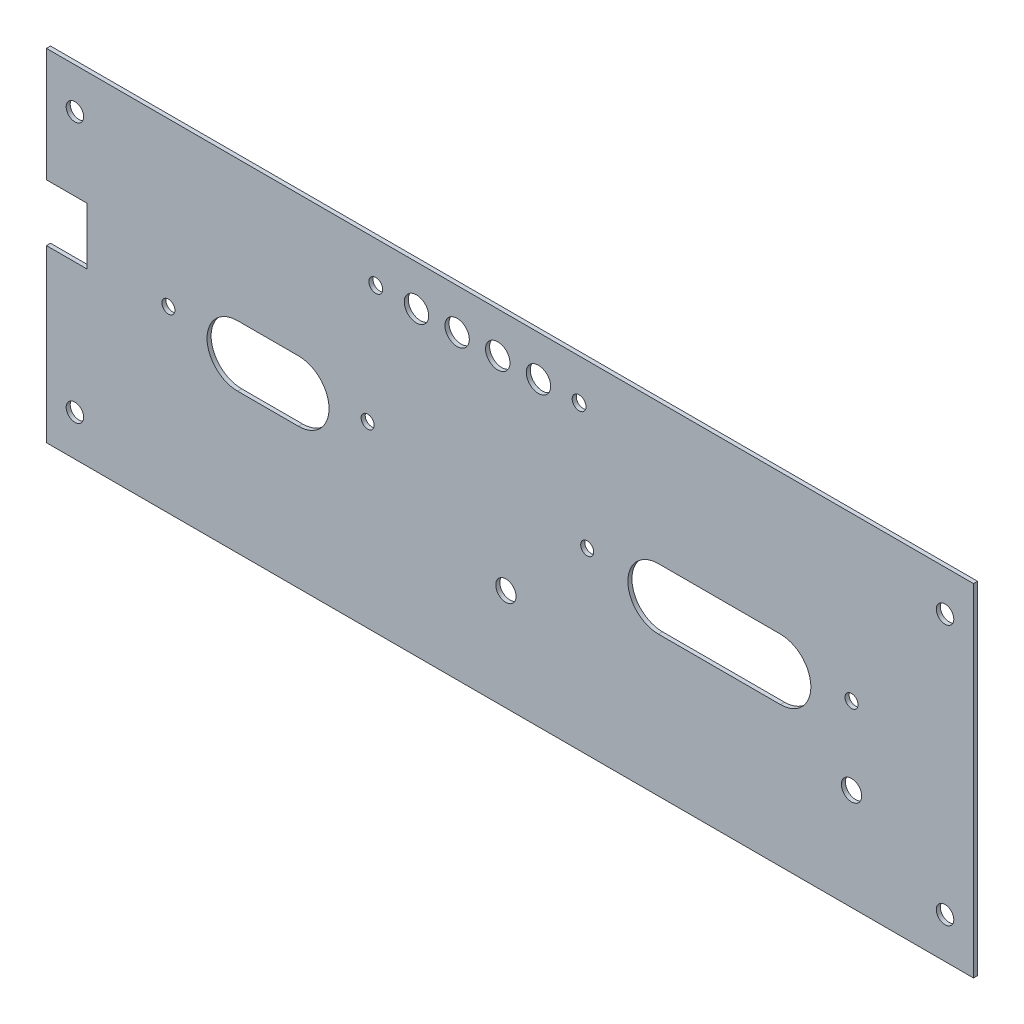
ISO-10303-21;
HEADER;
FILE_DESCRIPTION(('STEP AP214'),'2;1');
FILE_NAME('part.step','',(''),(''),'','','');
FILE_SCHEMA(('AUTOMOTIVE_DESIGN { 1 0 10303 214 1 1 1 1 }'));
ENDSEC;
DATA;
#1=APPLICATION_CONTEXT('core data for automotive mechanical design processes');
#2=APPLICATION_PROTOCOL_DEFINITION('international standard','automotive_design',2000,#1);
#3=PRODUCT_CONTEXT('',#1,'mechanical');
#4=PRODUCT('Part','Part','',(#3));
#5=PRODUCT_RELATED_PRODUCT_CATEGORY('part','',(#4));
#6=PRODUCT_DEFINITION_FORMATION('','',#4);
#7=PRODUCT_DEFINITION_CONTEXT('part definition',#1,'design');
#8=PRODUCT_DEFINITION('design','',#6,#7);
#9=PRODUCT_DEFINITION_SHAPE('','',#8);
#10=(LENGTH_UNIT() NAMED_UNIT(*) SI_UNIT(.MILLI.,.METRE.));
#11=(NAMED_UNIT(*) PLANE_ANGLE_UNIT() SI_UNIT($,.RADIAN.));
#12=(NAMED_UNIT(*) SI_UNIT($,.STERADIAN.) SOLID_ANGLE_UNIT());
#13=UNCERTAINTY_MEASURE_WITH_UNIT(LENGTH_MEASURE(1.E-05),#10,'distance_accuracy_value','');
#14=(GEOMETRIC_REPRESENTATION_CONTEXT(3) GLOBAL_UNCERTAINTY_ASSIGNED_CONTEXT((#13)) GLOBAL_UNIT_ASSIGNED_CONTEXT((#10,
#11,#12)) REPRESENTATION_CONTEXT('',''));
#15=CARTESIAN_POINT('',(0.,0.,0.));
#16=DIRECTION('',(0.,0.,1.));
#17=DIRECTION('',(1.,0.,0.));
#18=AXIS2_PLACEMENT_3D('',#15,#16,#17);
#19=CARTESIAN_POINT('',(-114.,-42.,1.));
#20=DIRECTION('',(1.,0.,0.));
#21=DIRECTION('',(0.,0.,-1.));
#22=AXIS2_PLACEMENT_3D('',#19,#20,#21);
#23=PLANE('',#22);
#24=DIRECTION('',(0.,-1.,0.));
#25=VECTOR('',#24,1.);
#26=CARTESIAN_POINT('',(-114.,-42.,0.));
#27=LINE('',#26,#25);
#28=CARTESIAN_POINT('',(-114.,42.,0.));
#29=VERTEX_POINT('',#28);
#30=CARTESIAN_POINT('',(-114.,14.,0.));
#31=VERTEX_POINT('',#30);
#32=EDGE_CURVE('E293',#29,#31,#27,.T.);
#33=ORIENTED_EDGE('',*,*,#32,.T.);
#34=DIRECTION('',(0.,0.,1.));
#35=VECTOR('',#34,1.);
#36=CARTESIAN_POINT('',(-114.,14.,1.));
#37=LINE('',#36,#35);
#38=CARTESIAN_POINT('',(-114.,14.,1.));
#39=VERTEX_POINT('',#38);
#40=EDGE_CURVE('E11',#31,#39,#37,.T.);
#41=ORIENTED_EDGE('',*,*,#40,.T.);
#42=DIRECTION('',(0.,-1.,0.));
#43=VECTOR('',#42,1.);
#44=CARTESIAN_POINT('',(-114.,-42.,1.));
#45=LINE('',#44,#43);
#46=CARTESIAN_POINT('',(-114.,42.,1.));
#47=VERTEX_POINT('',#46);
#48=EDGE_CURVE('E282',#47,#39,#45,.T.);
#49=ORIENTED_EDGE('',*,*,#48,.F.);
#50=DIRECTION('',(0.,0.,-1.));
#51=VECTOR('',#50,1.);
#52=CARTESIAN_POINT('',(-114.,42.,1.));
#53=LINE('',#52,#51);
#54=EDGE_CURVE('E292',#47,#29,#53,.T.);
#55=ORIENTED_EDGE('',*,*,#54,.T.);
#56=EDGE_LOOP('',(#33,#41,#49,#55));
#57=FACE_BOUND('',#56,.T.);
#58=ADVANCED_FACE('F31',(#57),#23,.F.);
#59=CARTESIAN_POINT('',(-114.,-42.,1.));
#60=DIRECTION('',(0.,0.,-1.));
#61=DIRECTION('',(-1.,0.,0.));
#62=AXIS2_PLACEMENT_3D('',#59,#60,#61);
#63=PLANE('',#62);
#64=CARTESIAN_POINT('',(84.,-17.,1.));
#65=DIRECTION('',(0.,0.,1.));
#66=DIRECTION('',(1.,0.,0.));
#67=AXIS2_PLACEMENT_3D('',#64,#65,#66);
#68=CIRCLE('',#67,2.5);
#69=CARTESIAN_POINT('',(86.5,-17.,1.));
#70=VERTEX_POINT('',#69);
#71=EDGE_CURVE('E350',#70,#70,#68,.T.);
#72=ORIENTED_EDGE('',*,*,#71,.F.);
#73=EDGE_LOOP('',(#72));
#74=FACE_BOUND('',#73,.T.);
#75=CARTESIAN_POINT('',(-23.,32.,1.));
#76=DIRECTION('',(0.,0.,1.));
#77=DIRECTION('',(1.,0.,0.));
#78=AXIS2_PLACEMENT_3D('',#75,#76,#77);
#79=CIRCLE('',#78,3.);
#80=CARTESIAN_POINT('',(-20.,32.,1.));
#81=VERTEX_POINT('',#80);
#82=EDGE_CURVE('E340',#81,#81,#79,.T.);
#83=ORIENTED_EDGE('',*,*,#82,.F.);
#84=EDGE_LOOP('',(#83));
#85=FACE_BOUND('',#84,.T.);
#86=CARTESIAN_POINT('',(-13.,32.,1.));
#87=DIRECTION('',(0.,0.,1.));
#88=DIRECTION('',(1.,0.,0.));
#89=AXIS2_PLACEMENT_3D('',#86,#87,#88);
#90=CIRCLE('',#89,3.);
#91=CARTESIAN_POINT('',(-10.,32.,1.));
#92=VERTEX_POINT('',#91);
#93=EDGE_CURVE('E337',#92,#92,#90,.T.);
#94=ORIENTED_EDGE('',*,*,#93,.F.);
#95=EDGE_LOOP('',(#94));
#96=FACE_BOUND('',#95,.T.);
#97=CARTESIAN_POINT('',(-3.00000000000001,32.,1.));
#98=DIRECTION('',(0.,0.,1.));
#99=DIRECTION('',(1.,0.,0.));
#100=AXIS2_PLACEMENT_3D('',#97,#98,#99);
#101=CIRCLE('',#100,3.);
#102=CARTESIAN_POINT('',(0.,32.,1.));
#103=VERTEX_POINT('',#102);
#104=EDGE_CURVE('E334',#103,#103,#101,.T.);
#105=ORIENTED_EDGE('',*,*,#104,.F.);
#106=EDGE_LOOP('',(#105));
#107=FACE_BOUND('',#106,.T.);
#108=CARTESIAN_POINT('',(6.99999999999999,32.,1.));
#109=DIRECTION('',(0.,0.,1.));
#110=DIRECTION('',(1.,0.,0.));
#111=AXIS2_PLACEMENT_3D('',#108,#109,#110);
#112=CIRCLE('',#111,3.);
#113=CARTESIAN_POINT('',(9.99999999999999,32.,1.));
#114=VERTEX_POINT('',#113);
#115=EDGE_CURVE('E330',#114,#114,#112,.T.);
#116=ORIENTED_EDGE('',*,*,#115,.F.);
#117=EDGE_LOOP('',(#116));
#118=FACE_BOUND('',#117,.T.);
#119=CARTESIAN_POINT('',(-1.00000000000001,-17.,1.));
#120=DIRECTION('',(0.,0.,1.));
#121=DIRECTION('',(1.,0.,0.));
#122=AXIS2_PLACEMENT_3D('',#119,#120,#121);
#123=CIRCLE('',#122,2.5);
#124=CARTESIAN_POINT('',(1.49999999999999,-17.,1.));
#125=VERTEX_POINT('',#124);
#126=EDGE_CURVE('E326',#125,#125,#123,.T.);
#127=ORIENTED_EDGE('',*,*,#126,.F.);
#128=EDGE_LOOP('',(#127));
#129=FACE_BOUND('',#128,.T.);
#130=CARTESIAN_POINT('',(17.,32.,1.));
#131=DIRECTION('',(0.,0.,1.));
#132=DIRECTION('',(1.,0.,0.));
#133=AXIS2_PLACEMENT_3D('',#130,#131,#132);
#134=CIRCLE('',#133,1.7);
#135=CARTESIAN_POINT('',(18.7,32.,1.));
#136=VERTEX_POINT('',#135);
#137=EDGE_CURVE('E322',#136,#136,#134,.T.);
#138=ORIENTED_EDGE('',*,*,#137,.F.);
#139=EDGE_LOOP('',(#138));
#140=FACE_BOUND('',#139,.T.);
#141=CARTESIAN_POINT('',(-33.,32.,1.));
#142=DIRECTION('',(0.,0.,1.));
#143=DIRECTION('',(1.,0.,0.));
#144=AXIS2_PLACEMENT_3D('',#141,#142,#143);
#145=CIRCLE('',#144,1.7);
#146=CARTESIAN_POINT('',(-31.3,32.,1.));
#147=VERTEX_POINT('',#146);
#148=EDGE_CURVE('E318',#147,#147,#145,.T.);
#149=ORIENTED_EDGE('',*,*,#148,.F.);
#150=EDGE_LOOP('',(#149));
#151=FACE_BOUND('',#150,.T.);
#152=CARTESIAN_POINT('',(-35.,2.00000000000001,1.));
#153=DIRECTION('',(0.,0.,1.));
#154=DIRECTION('',(1.,0.,0.));
#155=AXIS2_PLACEMENT_3D('',#152,#153,#154);
#156=CIRCLE('',#155,1.60000000000001);
#157=CARTESIAN_POINT('',(-33.4,2.00000000000001,1.));
#158=VERTEX_POINT('',#157);
#159=EDGE_CURVE('E170',#158,#158,#156,.T.);
#160=ORIENTED_EDGE('',*,*,#159,.F.);
#161=EDGE_LOOP('',(#160));
#162=FACE_BOUND('',#161,.T.);
#163=DIRECTION('',(1.,0.,0.));
#164=VECTOR('',#163,1.);
#165=CARTESIAN_POINT('',(-67.,-7.5,1.));
#166=LINE('',#165,#164);
#167=CARTESIAN_POINT('',(-67.,-7.5,1.));
#168=VERTEX_POINT('',#167);
#169=CARTESIAN_POINT('',(-52.,-7.5,1.));
#170=VERTEX_POINT('',#169);
#171=EDGE_CURVE('E176',#168,#170,#166,.T.);
#172=ORIENTED_EDGE('',*,*,#171,.F.);
#173=CARTESIAN_POINT('',(-67.,0.,1.));
#174=DIRECTION('',(0.,0.,1.));
#175=DIRECTION('',(1.,0.,0.));
#176=AXIS2_PLACEMENT_3D('',#173,#174,#175);
#177=CIRCLE('',#176,7.5);
#178=CARTESIAN_POINT('',(-67.,7.5,1.));
#179=VERTEX_POINT('',#178);
#180=EDGE_CURVE('E48',#179,#168,#177,.T.);
#181=ORIENTED_EDGE('',*,*,#180,.F.);
#182=DIRECTION('',(-1.,0.,0.));
#183=VECTOR('',#182,1.);
#184=CARTESIAN_POINT('',(-67.,7.5,1.));
#185=LINE('',#184,#183);
#186=CARTESIAN_POINT('',(-52.,7.5,1.));
#187=VERTEX_POINT('',#186);
#188=EDGE_CURVE('E164',#187,#179,#185,.T.);
#189=ORIENTED_EDGE('',*,*,#188,.F.);
#190=CARTESIAN_POINT('',(-52.,0.,1.));
#191=DIRECTION('',(0.,0.,1.));
#192=DIRECTION('',(-1.,0.,0.));
#193=AXIS2_PLACEMENT_3D('',#190,#191,#192);
#194=CIRCLE('',#193,7.5);
#195=EDGE_CURVE('E167',#170,#187,#194,.T.);
#196=ORIENTED_EDGE('',*,*,#195,.F.);
#197=EDGE_LOOP('',(#172,#181,#189,#196));
#198=FACE_BOUND('',#197,.T.);
#199=CARTESIAN_POINT('',(-84.,2.00000000000001,1.));
#200=DIRECTION('',(0.,0.,1.));
#201=DIRECTION('',(1.,0.,0.));
#202=AXIS2_PLACEMENT_3D('',#199,#200,#201);
#203=CIRCLE('',#202,1.60000000000001);
#204=CARTESIAN_POINT('',(-82.4,2.00000000000001,1.));
#205=VERTEX_POINT('',#204);
#206=EDGE_CURVE('E183',#205,#205,#203,.T.);
#207=ORIENTED_EDGE('',*,*,#206,.F.);
#208=EDGE_LOOP('',(#207));
#209=FACE_BOUND('',#208,.T.);
#210=CARTESIAN_POINT('',(84.,2.00000000000001,1.));
#211=DIRECTION('',(0.,0.,1.));
#212=DIRECTION('',(1.,0.,0.));
#213=AXIS2_PLACEMENT_3D('',#210,#211,#212);
#214=CIRCLE('',#213,1.60000000000001);
#215=CARTESIAN_POINT('',(85.6,2.00000000000001,1.));
#216=VERTEX_POINT('',#215);
#217=EDGE_CURVE('E190',#216,#216,#214,.T.);
#218=ORIENTED_EDGE('',*,*,#217,.F.);
#219=EDGE_LOOP('',(#218));
#220=FACE_BOUND('',#219,.T.);
#221=DIRECTION('',(1.,0.,0.));
#222=VECTOR('',#221,1.);
#223=CARTESIAN_POINT('',(36.5,-7.5,1.));
#224=LINE('',#223,#222);
#225=CARTESIAN_POINT('',(36.5,-7.5,1.));
#226=VERTEX_POINT('',#225);
#227=CARTESIAN_POINT('',(66.5,-7.5,1.));
#228=VERTEX_POINT('',#227);
#229=EDGE_CURVE('E214',#226,#228,#224,.T.);
#230=ORIENTED_EDGE('',*,*,#229,.F.);
#231=CARTESIAN_POINT('',(36.5,0.,1.));
#232=DIRECTION('',(0.,0.,1.));
#233=DIRECTION('',(1.,0.,0.));
#234=AXIS2_PLACEMENT_3D('',#231,#232,#233);
#235=CIRCLE('',#234,7.5);
#236=CARTESIAN_POINT('',(36.5,7.5,1.));
#237=VERTEX_POINT('',#236);
#238=EDGE_CURVE('E196',#237,#226,#235,.T.);
#239=ORIENTED_EDGE('',*,*,#238,.F.);
#240=DIRECTION('',(-1.,0.,0.));
#241=VECTOR('',#240,1.);
#242=CARTESIAN_POINT('',(36.5,7.5,1.));
#243=LINE('',#242,#241);
#244=CARTESIAN_POINT('',(66.5,7.5,1.));
#245=VERTEX_POINT('',#244);
#246=EDGE_CURVE('E203',#245,#237,#243,.T.);
#247=ORIENTED_EDGE('',*,*,#246,.F.);
#248=CARTESIAN_POINT('',(66.5,0.,1.));
#249=DIRECTION('',(0.,0.,1.));
#250=DIRECTION('',(-1.,0.,0.));
#251=AXIS2_PLACEMENT_3D('',#248,#249,#250);
#252=CIRCLE('',#251,7.5);
#253=EDGE_CURVE('E217',#228,#245,#252,.T.);
#254=ORIENTED_EDGE('',*,*,#253,.F.);
#255=EDGE_LOOP('',(#230,#239,#247,#254));
#256=FACE_BOUND('',#255,.T.);
#257=CARTESIAN_POINT('',(19.,2.00000000000001,1.));
#258=DIRECTION('',(0.,0.,1.));
#259=DIRECTION('',(1.,0.,0.));
#260=AXIS2_PLACEMENT_3D('',#257,#258,#259);
#261=CIRCLE('',#260,1.60000000000001);
#262=CARTESIAN_POINT('',(20.6,2.00000000000001,1.));
#263=VERTEX_POINT('',#262);
#264=EDGE_CURVE('E224',#263,#263,#261,.T.);
#265=ORIENTED_EDGE('',*,*,#264,.F.);
#266=EDGE_LOOP('',(#265));
#267=FACE_BOUND('',#266,.T.);
#268=CARTESIAN_POINT('',(-107.,-32.,1.));
#269=DIRECTION('',(0.,0.,1.));
#270=DIRECTION('',(1.,0.,0.));
#271=AXIS2_PLACEMENT_3D('',#268,#269,#270);
#272=CIRCLE('',#271,2.15);
#273=CARTESIAN_POINT('',(-104.85,-32.,1.));
#274=VERTEX_POINT('',#273);
#275=EDGE_CURVE('E264',#274,#274,#272,.T.);
#276=ORIENTED_EDGE('',*,*,#275,.F.);
#277=EDGE_LOOP('',(#276));
#278=FACE_BOUND('',#277,.T.);
#279=CARTESIAN_POINT('',(107.,32.,1.));
#280=DIRECTION('',(0.,0.,1.));
#281=DIRECTION('',(1.,0.,0.));
#282=AXIS2_PLACEMENT_3D('',#279,#280,#281);
#283=CIRCLE('',#282,2.15);
#284=CARTESIAN_POINT('',(109.15,32.,1.));
#285=VERTEX_POINT('',#284);
#286=EDGE_CURVE('E276',#285,#285,#283,.T.);
#287=ORIENTED_EDGE('',*,*,#286,.F.);
#288=EDGE_LOOP('',(#287));
#289=FACE_BOUND('',#288,.T.);
#290=ORIENTED_EDGE('',*,*,#48,.T.);
#291=DIRECTION('',(-1.,0.,0.));
#292=VECTOR('',#291,1.);
#293=CARTESIAN_POINT('',(-118.464145401672,14.,1.));
#294=LINE('',#293,#292);
#295=CARTESIAN_POINT('',(-104.,14.,1.));
#296=VERTEX_POINT('',#295);
#297=EDGE_CURVE('E241',#296,#39,#294,.T.);
#298=ORIENTED_EDGE('',*,*,#297,.F.);
#299=DIRECTION('',(0.,1.,0.));
#300=VECTOR('',#299,1.);
#301=CARTESIAN_POINT('',(-104.,0.,1.));
#302=LINE('',#301,#300);
#303=CARTESIAN_POINT('',(-104.,0.,1.));
#304=VERTEX_POINT('',#303);
#305=EDGE_CURVE('E249',#304,#296,#302,.T.);
#306=ORIENTED_EDGE('',*,*,#305,.F.);
#307=DIRECTION('',(1.,0.,0.));
#308=VECTOR('',#307,1.);
#309=CARTESIAN_POINT('',(-118.464145401672,0.,1.));
#310=LINE('',#309,#308);
#311=CARTESIAN_POINT('',(-114.,0.,1.));
#312=VERTEX_POINT('',#311);
#313=EDGE_CURVE('E234',#312,#304,#310,.T.);
#314=ORIENTED_EDGE('',*,*,#313,.F.);
#315=CARTESIAN_POINT('',(-114.,-42.,1.));
#316=VERTEX_POINT('',#315);
#317=EDGE_CURVE('E286',#312,#316,#45,.T.);
#318=ORIENTED_EDGE('',*,*,#317,.T.);
#319=DIRECTION('',(1.,0.,0.));
#320=VECTOR('',#319,1.);
#321=CARTESIAN_POINT('',(-114.,-42.,1.));
#322=LINE('',#321,#320);
#323=CARTESIAN_POINT('',(114.,-42.,1.));
#324=VERTEX_POINT('',#323);
#325=EDGE_CURVE('E285',#316,#324,#322,.T.);
#326=ORIENTED_EDGE('',*,*,#325,.T.);
#327=DIRECTION('',(0.,1.,0.));
#328=VECTOR('',#327,1.);
#329=CARTESIAN_POINT('',(114.,-42.,1.));
#330=LINE('',#329,#328);
#331=CARTESIAN_POINT('',(114.,42.,1.));
#332=VERTEX_POINT('',#331);
#333=EDGE_CURVE('E288',#324,#332,#330,.T.);
#334=ORIENTED_EDGE('',*,*,#333,.T.);
#335=DIRECTION('',(-1.,0.,0.));
#336=VECTOR('',#335,1.);
#337=CARTESIAN_POINT('',(-114.,42.,1.));
#338=LINE('',#337,#336);
#339=EDGE_CURVE('E290',#332,#47,#338,.T.);
#340=ORIENTED_EDGE('',*,*,#339,.T.);
#341=EDGE_LOOP('',(#290,#298,#306,#314,#318,#326,#334,#340));
#342=FACE_BOUND('',#341,.T.);
#343=CARTESIAN_POINT('',(-107.,32.,1.));
#344=DIRECTION('',(0.,0.,1.));
#345=DIRECTION('',(-1.,0.,0.));
#346=AXIS2_PLACEMENT_3D('',#343,#344,#345);
#347=CIRCLE('',#346,2.15);
#348=CARTESIAN_POINT('',(-109.15,32.,1.));
#349=VERTEX_POINT('',#348);
#350=EDGE_CURVE('E270',#349,#349,#347,.T.);
#351=ORIENTED_EDGE('',*,*,#350,.F.);
#352=EDGE_LOOP('',(#351));
#353=FACE_BOUND('',#352,.T.);
#354=CARTESIAN_POINT('',(107.,-32.,1.));
#355=DIRECTION('',(0.,0.,1.));
#356=DIRECTION('',(-1.,0.,0.));
#357=AXIS2_PLACEMENT_3D('',#354,#355,#356);
#358=CIRCLE('',#357,2.15);
#359=CARTESIAN_POINT('',(104.85,-32.,1.));
#360=VERTEX_POINT('',#359);
#361=EDGE_CURVE('E258',#360,#360,#358,.T.);
#362=ORIENTED_EDGE('',*,*,#361,.F.);
#363=EDGE_LOOP('',(#362));
#364=FACE_BOUND('',#363,.T.);
#365=ADVANCED_FACE('F370',(#74,#85,#96,#107,#118,#129,#140,#151,#162,#198,#209,#220,#256,#267,
#278,#289,#342,#353,#364),#63,.F.);
#366=CARTESIAN_POINT('',(-114.,-42.,0.));
#367=DIRECTION('',(0.,0.,-1.));
#368=DIRECTION('',(-1.,0.,0.));
#369=AXIS2_PLACEMENT_3D('',#366,#367,#368);
#370=PLANE('',#369);
#371=CARTESIAN_POINT('',(84.,-17.,0.));
#372=DIRECTION('',(0.,0.,-1.));
#373=DIRECTION('',(-1.,0.,0.));
#374=AXIS2_PLACEMENT_3D('',#371,#372,#373);
#375=CIRCLE('',#374,2.5);
#376=CARTESIAN_POINT('',(81.5,-17.,0.));
#377=VERTEX_POINT('',#376);
#378=EDGE_CURVE('E35',#377,#377,#375,.T.);
#379=ORIENTED_EDGE('',*,*,#378,.F.);
#380=EDGE_LOOP('',(#379));
#381=FACE_BOUND('',#380,.T.);
#382=CARTESIAN_POINT('',(-23.,32.,0.));
#383=DIRECTION('',(0.,0.,-1.));
#384=DIRECTION('',(-1.,0.,0.));
#385=AXIS2_PLACEMENT_3D('',#382,#383,#384);
#386=CIRCLE('',#385,3.);
#387=CARTESIAN_POINT('',(-26.,32.,0.));
#388=VERTEX_POINT('',#387);
#389=EDGE_CURVE('E338',#388,#388,#386,.T.);
#390=ORIENTED_EDGE('',*,*,#389,.F.);
#391=EDGE_LOOP('',(#390));
#392=FACE_BOUND('',#391,.T.);
#393=CARTESIAN_POINT('',(-13.,32.,0.));
#394=DIRECTION('',(0.,0.,-1.));
#395=DIRECTION('',(-1.,0.,0.));
#396=AXIS2_PLACEMENT_3D('',#393,#394,#395);
#397=CIRCLE('',#396,3.);
#398=CARTESIAN_POINT('',(-16.,32.,0.));
#399=VERTEX_POINT('',#398);
#400=EDGE_CURVE('E335',#399,#399,#397,.T.);
#401=ORIENTED_EDGE('',*,*,#400,.F.);
#402=EDGE_LOOP('',(#401));
#403=FACE_BOUND('',#402,.T.);
#404=CARTESIAN_POINT('',(-3.00000000000001,32.,0.));
#405=DIRECTION('',(0.,0.,-1.));
#406=DIRECTION('',(-1.,0.,0.));
#407=AXIS2_PLACEMENT_3D('',#404,#405,#406);
#408=CIRCLE('',#407,3.);
#409=CARTESIAN_POINT('',(-6.00000000000001,32.,0.));
#410=VERTEX_POINT('',#409);
#411=EDGE_CURVE('E331',#410,#410,#408,.T.);
#412=ORIENTED_EDGE('',*,*,#411,.F.);
#413=EDGE_LOOP('',(#412));
#414=FACE_BOUND('',#413,.T.);
#415=CARTESIAN_POINT('',(6.99999999999999,32.,0.));
#416=DIRECTION('',(0.,0.,-1.));
#417=DIRECTION('',(-1.,0.,0.));
#418=AXIS2_PLACEMENT_3D('',#415,#416,#417);
#419=CIRCLE('',#418,3.);
#420=CARTESIAN_POINT('',(3.99999999999998,32.,0.));
#421=VERTEX_POINT('',#420);
#422=EDGE_CURVE('E327',#421,#421,#419,.T.);
#423=ORIENTED_EDGE('',*,*,#422,.F.);
#424=EDGE_LOOP('',(#423));
#425=FACE_BOUND('',#424,.T.);
#426=CARTESIAN_POINT('',(-1.00000000000001,-17.,0.));
#427=DIRECTION('',(0.,0.,-1.));
#428=DIRECTION('',(-1.,0.,0.));
#429=AXIS2_PLACEMENT_3D('',#426,#427,#428);
#430=CIRCLE('',#429,2.5);
#431=CARTESIAN_POINT('',(-3.50000000000001,-17.,0.));
#432=VERTEX_POINT('',#431);
#433=EDGE_CURVE('E323',#432,#432,#430,.T.);
#434=ORIENTED_EDGE('',*,*,#433,.F.);
#435=EDGE_LOOP('',(#434));
#436=FACE_BOUND('',#435,.T.);
#437=CARTESIAN_POINT('',(17.,32.,0.));
#438=DIRECTION('',(0.,0.,-1.));
#439=DIRECTION('',(-1.,0.,0.));
#440=AXIS2_PLACEMENT_3D('',#437,#438,#439);
#441=CIRCLE('',#440,1.7);
#442=CARTESIAN_POINT('',(15.3,32.,0.));
#443=VERTEX_POINT('',#442);
#444=EDGE_CURVE('E319',#443,#443,#441,.T.);
#445=ORIENTED_EDGE('',*,*,#444,.F.);
#446=EDGE_LOOP('',(#445));
#447=FACE_BOUND('',#446,.T.);
#448=CARTESIAN_POINT('',(-33.,32.,0.));
#449=DIRECTION('',(0.,0.,-1.));
#450=DIRECTION('',(-1.,0.,0.));
#451=AXIS2_PLACEMENT_3D('',#448,#449,#450);
#452=CIRCLE('',#451,1.7);
#453=CARTESIAN_POINT('',(-34.7,32.,0.));
#454=VERTEX_POINT('',#453);
#455=EDGE_CURVE('E315',#454,#454,#452,.T.);
#456=ORIENTED_EDGE('',*,*,#455,.F.);
#457=EDGE_LOOP('',(#456));
#458=FACE_BOUND('',#457,.T.);
#459=CARTESIAN_POINT('',(-35.,2.00000000000001,0.));
#460=DIRECTION('',(0.,0.,1.));
#461=DIRECTION('',(1.,0.,0.));
#462=AXIS2_PLACEMENT_3D('',#459,#460,#461);
#463=CIRCLE('',#462,1.60000000000001);
#464=CARTESIAN_POINT('',(-33.4,2.00000000000001,0.));
#465=VERTEX_POINT('',#464);
#466=EDGE_CURVE('E177',#465,#465,#463,.T.);
#467=ORIENTED_EDGE('',*,*,#466,.T.);
#468=EDGE_LOOP('',(#467));
#469=FACE_BOUND('',#468,.T.);
#470=CARTESIAN_POINT('',(-67.,0.,0.));
#471=DIRECTION('',(0.,0.,1.));
#472=DIRECTION('',(1.,0.,0.));
#473=AXIS2_PLACEMENT_3D('',#470,#471,#472);
#474=CIRCLE('',#473,7.5);
#475=CARTESIAN_POINT('',(-67.,7.5,0.));
#476=VERTEX_POINT('',#475);
#477=CARTESIAN_POINT('',(-67.,-7.5,0.));
#478=VERTEX_POINT('',#477);
#479=EDGE_CURVE('E148',#476,#478,#474,.T.);
#480=ORIENTED_EDGE('',*,*,#479,.T.);
#481=DIRECTION('',(1.,0.,0.));
#482=VECTOR('',#481,1.);
#483=CARTESIAN_POINT('',(-67.,-7.5,0.));
#484=LINE('',#483,#482);
#485=CARTESIAN_POINT('',(-52.,-7.5,0.));
#486=VERTEX_POINT('',#485);
#487=EDGE_CURVE('E157',#478,#486,#484,.T.);
#488=ORIENTED_EDGE('',*,*,#487,.T.);
#489=CARTESIAN_POINT('',(-52.,0.,0.));
#490=DIRECTION('',(0.,0.,1.));
#491=DIRECTION('',(-1.,0.,0.));
#492=AXIS2_PLACEMENT_3D('',#489,#490,#491);
#493=CIRCLE('',#492,7.5);
#494=CARTESIAN_POINT('',(-52.,7.5,0.));
#495=VERTEX_POINT('',#494);
#496=EDGE_CURVE('E56',#486,#495,#493,.T.);
#497=ORIENTED_EDGE('',*,*,#496,.T.);
#498=DIRECTION('',(-1.,0.,0.));
#499=VECTOR('',#498,1.);
#500=CARTESIAN_POINT('',(-67.,7.5,0.));
#501=LINE('',#500,#499);
#502=EDGE_CURVE('E154',#495,#476,#501,.T.);
#503=ORIENTED_EDGE('',*,*,#502,.T.);
#504=EDGE_LOOP('',(#480,#488,#497,#503));
#505=FACE_BOUND('',#504,.T.);
#506=CARTESIAN_POINT('',(-84.,2.00000000000001,0.));
#507=DIRECTION('',(0.,0.,1.));
#508=DIRECTION('',(1.,0.,0.));
#509=AXIS2_PLACEMENT_3D('',#506,#507,#508);
#510=CIRCLE('',#509,1.60000000000001);
#511=CARTESIAN_POINT('',(-82.4,2.00000000000001,0.));
#512=VERTEX_POINT('',#511);
#513=EDGE_CURVE('E187',#512,#512,#510,.T.);
#514=ORIENTED_EDGE('',*,*,#513,.T.);
#515=EDGE_LOOP('',(#514));
#516=FACE_BOUND('',#515,.T.);
#517=CARTESIAN_POINT('',(84.,2.00000000000001,0.));
#518=DIRECTION('',(0.,0.,1.));
#519=DIRECTION('',(1.,0.,0.));
#520=AXIS2_PLACEMENT_3D('',#517,#518,#519);
#521=CIRCLE('',#520,1.60000000000001);
#522=CARTESIAN_POINT('',(85.6,2.00000000000001,0.));
#523=VERTEX_POINT('',#522);
#524=EDGE_CURVE('E193',#523,#523,#521,.T.);
#525=ORIENTED_EDGE('',*,*,#524,.T.);
#526=EDGE_LOOP('',(#525));
#527=FACE_BOUND('',#526,.T.);
#528=CARTESIAN_POINT('',(36.5,0.,0.));
#529=DIRECTION('',(0.,0.,1.));
#530=DIRECTION('',(1.,0.,0.));
#531=AXIS2_PLACEMENT_3D('',#528,#529,#530);
#532=CIRCLE('',#531,7.5);
#533=CARTESIAN_POINT('',(36.5,7.5,0.));
#534=VERTEX_POINT('',#533);
#535=CARTESIAN_POINT('',(36.5,-7.5,0.));
#536=VERTEX_POINT('',#535);
#537=EDGE_CURVE('E199',#534,#536,#532,.T.);
#538=ORIENTED_EDGE('',*,*,#537,.T.);
#539=DIRECTION('',(1.,0.,0.));
#540=VECTOR('',#539,1.);
#541=CARTESIAN_POINT('',(36.5,-7.5,0.));
#542=LINE('',#541,#540);
#543=CARTESIAN_POINT('',(66.5,-7.5,0.));
#544=VERTEX_POINT('',#543);
#545=EDGE_CURVE('E202',#536,#544,#542,.T.);
#546=ORIENTED_EDGE('',*,*,#545,.T.);
#547=CARTESIAN_POINT('',(66.5,0.,0.));
#548=DIRECTION('',(0.,0.,1.));
#549=DIRECTION('',(-1.,0.,0.));
#550=AXIS2_PLACEMENT_3D('',#547,#548,#549);
#551=CIRCLE('',#550,7.5);
#552=CARTESIAN_POINT('',(66.5,7.5,0.));
#553=VERTEX_POINT('',#552);
#554=EDGE_CURVE('E206',#544,#553,#551,.T.);
#555=ORIENTED_EDGE('',*,*,#554,.T.);
#556=DIRECTION('',(-1.,0.,0.));
#557=VECTOR('',#556,1.);
#558=CARTESIAN_POINT('',(36.5,7.5,0.));
#559=LINE('',#558,#557);
#560=EDGE_CURVE('E209',#553,#534,#559,.T.);
#561=ORIENTED_EDGE('',*,*,#560,.T.);
#562=EDGE_LOOP('',(#538,#546,#555,#561));
#563=FACE_BOUND('',#562,.T.);
#564=CARTESIAN_POINT('',(19.,2.00000000000001,0.));
#565=DIRECTION('',(0.,0.,1.));
#566=DIRECTION('',(1.,0.,0.));
#567=AXIS2_PLACEMENT_3D('',#564,#565,#566);
#568=CIRCLE('',#567,1.60000000000001);
#569=CARTESIAN_POINT('',(20.6,2.00000000000001,0.));
#570=VERTEX_POINT('',#569);
#571=EDGE_CURVE('E231',#570,#570,#568,.T.);
#572=ORIENTED_EDGE('',*,*,#571,.T.);
#573=EDGE_LOOP('',(#572));
#574=FACE_BOUND('',#573,.T.);
#575=DIRECTION('',(-1.,0.,0.));
#576=VECTOR('',#575,1.);
#577=CARTESIAN_POINT('',(-118.464145401672,14.,0.));
#578=LINE('',#577,#576);
#579=CARTESIAN_POINT('',(-104.,14.,0.));
#580=VERTEX_POINT('',#579);
#581=EDGE_CURVE('E244',#580,#31,#578,.T.);
#582=ORIENTED_EDGE('',*,*,#581,.T.);
#583=ORIENTED_EDGE('',*,*,#32,.F.);
#584=DIRECTION('',(-1.,0.,0.));
#585=VECTOR('',#584,1.);
#586=CARTESIAN_POINT('',(-114.,42.,0.));
#587=LINE('',#586,#585);
#588=CARTESIAN_POINT('',(114.,42.,0.));
#589=VERTEX_POINT('',#588);
#590=EDGE_CURVE('E300',#589,#29,#587,.T.);
#591=ORIENTED_EDGE('',*,*,#590,.F.);
#592=DIRECTION('',(0.,1.,0.));
#593=VECTOR('',#592,1.);
#594=CARTESIAN_POINT('',(114.,-42.,0.));
#595=LINE('',#594,#593);
#596=CARTESIAN_POINT('',(114.,-42.,0.));
#597=VERTEX_POINT('',#596);
#598=EDGE_CURVE('E298',#597,#589,#595,.T.);
#599=ORIENTED_EDGE('',*,*,#598,.F.);
#600=DIRECTION('',(1.,0.,0.));
#601=VECTOR('',#600,1.);
#602=CARTESIAN_POINT('',(-114.,-42.,0.));
#603=LINE('',#602,#601);
#604=CARTESIAN_POINT('',(-114.,-42.,0.));
#605=VERTEX_POINT('',#604);
#606=EDGE_CURVE('E296',#605,#597,#603,.T.);
#607=ORIENTED_EDGE('',*,*,#606,.F.);
#608=CARTESIAN_POINT('',(-114.,0.,0.));
#609=VERTEX_POINT('',#608);
#610=EDGE_CURVE('E279',#609,#605,#27,.T.);
#611=ORIENTED_EDGE('',*,*,#610,.F.);
#612=DIRECTION('',(1.,0.,0.));
#613=VECTOR('',#612,1.);
#614=CARTESIAN_POINT('',(-118.464145401672,0.,0.));
#615=LINE('',#614,#613);
#616=CARTESIAN_POINT('',(-104.,0.,0.));
#617=VERTEX_POINT('',#616);
#618=EDGE_CURVE('E237',#609,#617,#615,.T.);
#619=ORIENTED_EDGE('',*,*,#618,.T.);
#620=DIRECTION('',(0.,1.,0.));
#621=VECTOR('',#620,1.);
#622=CARTESIAN_POINT('',(-104.,0.,0.));
#623=LINE('',#622,#621);
#624=EDGE_CURVE('E240',#617,#580,#623,.T.);
#625=ORIENTED_EDGE('',*,*,#624,.T.);
#626=EDGE_LOOP('',(#582,#583,#591,#599,#607,#611,#619,#625));
#627=FACE_BOUND('',#626,.T.);
#628=CARTESIAN_POINT('',(-107.,-32.,0.));
#629=DIRECTION('',(0.,0.,1.));
#630=DIRECTION('',(1.,0.,0.));
#631=AXIS2_PLACEMENT_3D('',#628,#629,#630);
#632=CIRCLE('',#631,2.15);
#633=CARTESIAN_POINT('',(-104.85,-32.,0.));
#634=VERTEX_POINT('',#633);
#635=EDGE_CURVE('E261',#634,#634,#632,.T.);
#636=ORIENTED_EDGE('',*,*,#635,.T.);
#637=EDGE_LOOP('',(#636));
#638=FACE_BOUND('',#637,.T.);
#639=CARTESIAN_POINT('',(107.,32.,0.));
#640=DIRECTION('',(0.,0.,1.));
#641=DIRECTION('',(1.,0.,0.));
#642=AXIS2_PLACEMENT_3D('',#639,#640,#641);
#643=CIRCLE('',#642,2.15);
#644=CARTESIAN_POINT('',(109.15,32.,0.));
#645=VERTEX_POINT('',#644);
#646=EDGE_CURVE('E273',#645,#645,#643,.T.);
#647=ORIENTED_EDGE('',*,*,#646,.T.);
#648=EDGE_LOOP('',(#647));
#649=FACE_BOUND('',#648,.T.);
#650=CARTESIAN_POINT('',(-107.,32.,0.));
#651=DIRECTION('',(0.,0.,1.));
#652=DIRECTION('',(-1.,0.,0.));
#653=AXIS2_PLACEMENT_3D('',#650,#651,#652);
#654=CIRCLE('',#653,2.15);
#655=CARTESIAN_POINT('',(-109.15,32.,0.));
#656=VERTEX_POINT('',#655);
#657=EDGE_CURVE('E267',#656,#656,#654,.T.);
#658=ORIENTED_EDGE('',*,*,#657,.T.);
#659=EDGE_LOOP('',(#658));
#660=FACE_BOUND('',#659,.T.);
#661=CARTESIAN_POINT('',(107.,-32.,0.));
#662=DIRECTION('',(0.,0.,1.));
#663=DIRECTION('',(-1.,0.,0.));
#664=AXIS2_PLACEMENT_3D('',#661,#662,#663);
#665=CIRCLE('',#664,2.15);
#666=CARTESIAN_POINT('',(104.85,-32.,0.));
#667=VERTEX_POINT('',#666);
#668=EDGE_CURVE('E255',#667,#667,#665,.T.);
#669=ORIENTED_EDGE('',*,*,#668,.T.);
#670=EDGE_LOOP('',(#669));
#671=FACE_BOUND('',#670,.T.);
#672=ADVANCED_FACE('F161',(#381,#392,#403,#414,#425,#436,#447,#458,#469,#505,#516,#527,#563,
#574,#627,#638,#649,#660,#671),#370,.T.);
#673=ORIENTED_EDGE('',*,*,#317,.F.);
#674=DIRECTION('',(0.,0.,-1.));
#675=VECTOR('',#674,1.);
#676=CARTESIAN_POINT('',(-114.,0.,1.));
#677=LINE('',#676,#675);
#678=EDGE_CURVE('E40',#312,#609,#677,.T.);
#679=ORIENTED_EDGE('',*,*,#678,.T.);
#680=ORIENTED_EDGE('',*,*,#610,.T.);
#681=DIRECTION('',(0.,0.,-1.));
#682=VECTOR('',#681,1.);
#683=CARTESIAN_POINT('',(-114.,-42.,1.));
#684=LINE('',#683,#682);
#685=EDGE_CURVE('E310',#316,#605,#684,.T.);
#686=ORIENTED_EDGE('',*,*,#685,.F.);
#687=EDGE_LOOP('',(#673,#679,#680,#686));
#688=FACE_BOUND('',#687,.T.);
#689=ADVANCED_FACE('F33',(#688),#23,.F.);
#690=CARTESIAN_POINT('',(-114.,-42.,1.));
#691=DIRECTION('',(0.,1.,0.));
#692=DIRECTION('',(0.,0.,1.));
#693=AXIS2_PLACEMENT_3D('',#690,#691,#692);
#694=PLANE('',#693);
#695=ORIENTED_EDGE('',*,*,#606,.T.);
#696=DIRECTION('',(0.,0.,-1.));
#697=VECTOR('',#696,1.);
#698=CARTESIAN_POINT('',(114.,-42.,1.));
#699=LINE('',#698,#697);
#700=EDGE_CURVE('E307',#324,#597,#699,.T.);
#701=ORIENTED_EDGE('',*,*,#700,.F.);
#702=ORIENTED_EDGE('',*,*,#325,.F.);
#703=ORIENTED_EDGE('',*,*,#685,.T.);
#704=EDGE_LOOP('',(#695,#701,#702,#703));
#705=FACE_BOUND('',#704,.T.);
#706=ADVANCED_FACE('F412',(#705),#694,.F.);
#707=CARTESIAN_POINT('',(114.,-42.,1.));
#708=DIRECTION('',(-1.,0.,0.));
#709=DIRECTION('',(0.,0.,1.));
#710=AXIS2_PLACEMENT_3D('',#707,#708,#709);
#711=PLANE('',#710);
#712=ORIENTED_EDGE('',*,*,#598,.T.);
#713=DIRECTION('',(0.,0.,-1.));
#714=VECTOR('',#713,1.);
#715=CARTESIAN_POINT('',(114.,42.,1.));
#716=LINE('',#715,#714);
#717=EDGE_CURVE('E304',#332,#589,#716,.T.);
#718=ORIENTED_EDGE('',*,*,#717,.F.);
#719=ORIENTED_EDGE('',*,*,#333,.F.);
#720=ORIENTED_EDGE('',*,*,#700,.T.);
#721=EDGE_LOOP('',(#712,#718,#719,#720));
#722=FACE_BOUND('',#721,.T.);
#723=ADVANCED_FACE('F447',(#722),#711,.F.);
#724=CARTESIAN_POINT('',(-114.,42.,1.));
#725=DIRECTION('',(0.,-1.,0.));
#726=DIRECTION('',(1.,0.,0.));
#727=AXIS2_PLACEMENT_3D('',#724,#725,#726);
#728=PLANE('',#727);
#729=ORIENTED_EDGE('',*,*,#590,.T.);
#730=ORIENTED_EDGE('',*,*,#54,.F.);
#731=ORIENTED_EDGE('',*,*,#339,.F.);
#732=ORIENTED_EDGE('',*,*,#717,.T.);
#733=EDGE_LOOP('',(#729,#730,#731,#732));
#734=FACE_BOUND('',#733,.T.);
#735=ADVANCED_FACE('F449',(#734),#728,.F.);
#736=CARTESIAN_POINT('',(107.,32.,1.));
#737=DIRECTION('',(0.,0.,-1.));
#738=DIRECTION('',(-1.,0.,0.));
#739=AXIS2_PLACEMENT_3D('',#736,#737,#738);
#740=CYLINDRICAL_SURFACE('',#739,2.15);
#741=ORIENTED_EDGE('',*,*,#286,.T.);
#742=EDGE_LOOP('',(#741));
#743=FACE_BOUND('',#742,.T.);
#744=ORIENTED_EDGE('',*,*,#646,.F.);
#745=EDGE_LOOP('',(#744));
#746=FACE_BOUND('',#745,.T.);
#747=ADVANCED_FACE('F451',(#743,#746),#740,.F.);
#748=CARTESIAN_POINT('',(-107.,32.,1.));
#749=DIRECTION('',(0.,0.,-1.));
#750=DIRECTION('',(-1.,0.,0.));
#751=AXIS2_PLACEMENT_3D('',#748,#749,#750);
#752=CYLINDRICAL_SURFACE('',#751,2.15);
#753=ORIENTED_EDGE('',*,*,#350,.T.);
#754=EDGE_LOOP('',(#753));
#755=FACE_BOUND('',#754,.T.);
#756=ORIENTED_EDGE('',*,*,#657,.F.);
#757=EDGE_LOOP('',(#756));
#758=FACE_BOUND('',#757,.T.);
#759=ADVANCED_FACE('F456',(#755,#758),#752,.F.);
#760=CARTESIAN_POINT('',(-107.,-32.,1.));
#761=DIRECTION('',(0.,0.,-1.));
#762=DIRECTION('',(-1.,0.,0.));
#763=AXIS2_PLACEMENT_3D('',#760,#761,#762);
#764=CYLINDRICAL_SURFACE('',#763,2.15);
#765=ORIENTED_EDGE('',*,*,#275,.T.);
#766=EDGE_LOOP('',(#765));
#767=FACE_BOUND('',#766,.T.);
#768=ORIENTED_EDGE('',*,*,#635,.F.);
#769=EDGE_LOOP('',(#768));
#770=FACE_BOUND('',#769,.T.);
#771=ADVANCED_FACE('F402',(#767,#770),#764,.F.);
#772=CARTESIAN_POINT('',(107.,-32.,1.));
#773=DIRECTION('',(0.,0.,-1.));
#774=DIRECTION('',(-1.,0.,0.));
#775=AXIS2_PLACEMENT_3D('',#772,#773,#774);
#776=CYLINDRICAL_SURFACE('',#775,2.15);
#777=ORIENTED_EDGE('',*,*,#361,.T.);
#778=EDGE_LOOP('',(#777));
#779=FACE_BOUND('',#778,.T.);
#780=ORIENTED_EDGE('',*,*,#668,.F.);
#781=EDGE_LOOP('',(#780));
#782=FACE_BOUND('',#781,.T.);
#783=ADVANCED_FACE('F398',(#779,#782),#776,.F.);
#784=CARTESIAN_POINT('',(-118.464145401672,14.,0.));
#785=DIRECTION('',(0.,1.,0.));
#786=DIRECTION('',(0.,0.,1.));
#787=AXIS2_PLACEMENT_3D('',#784,#785,#786);
#788=PLANE('',#787);
#789=ORIENTED_EDGE('',*,*,#581,.F.);
#790=DIRECTION('',(0.,0.,1.));
#791=VECTOR('',#790,1.);
#792=CARTESIAN_POINT('',(-104.,14.,0.));
#793=LINE('',#792,#791);
#794=EDGE_CURVE('E253',#580,#296,#793,.T.);
#795=ORIENTED_EDGE('',*,*,#794,.T.);
#796=ORIENTED_EDGE('',*,*,#297,.T.);
#797=ORIENTED_EDGE('',*,*,#40,.F.);
#798=EDGE_LOOP('',(#789,#795,#796,#797));
#799=FACE_BOUND('',#798,.T.);
#800=ADVANCED_FACE('F401',(#799),#788,.F.);
#801=CARTESIAN_POINT('',(-118.464145401672,0.,0.));
#802=DIRECTION('',(0.,-1.,0.));
#803=DIRECTION('',(0.,0.,-1.));
#804=AXIS2_PLACEMENT_3D('',#801,#802,#803);
#805=PLANE('',#804);
#806=ORIENTED_EDGE('',*,*,#313,.T.);
#807=DIRECTION('',(0.,0.,1.));
#808=VECTOR('',#807,1.);
#809=CARTESIAN_POINT('',(-104.,0.,0.));
#810=LINE('',#809,#808);
#811=EDGE_CURVE('E247',#617,#304,#810,.T.);
#812=ORIENTED_EDGE('',*,*,#811,.F.);
#813=ORIENTED_EDGE('',*,*,#618,.F.);
#814=ORIENTED_EDGE('',*,*,#678,.F.);
#815=EDGE_LOOP('',(#806,#812,#813,#814));
#816=FACE_BOUND('',#815,.T.);
#817=ADVANCED_FACE('F436',(#816),#805,.F.);
#818=CARTESIAN_POINT('',(-104.,0.,0.));
#819=DIRECTION('',(1.,0.,0.));
#820=DIRECTION('',(0.,0.,-1.));
#821=AXIS2_PLACEMENT_3D('',#818,#819,#820);
#822=PLANE('',#821);
#823=ORIENTED_EDGE('',*,*,#305,.T.);
#824=ORIENTED_EDGE('',*,*,#794,.F.);
#825=ORIENTED_EDGE('',*,*,#624,.F.);
#826=ORIENTED_EDGE('',*,*,#811,.T.);
#827=EDGE_LOOP('',(#823,#824,#825,#826));
#828=FACE_BOUND('',#827,.T.);
#829=ADVANCED_FACE('F434',(#828),#822,.F.);
#830=CARTESIAN_POINT('',(19.,2.00000000000001,0.));
#831=DIRECTION('',(0.,0.,1.));
#832=DIRECTION('',(1.,0.,0.));
#833=AXIS2_PLACEMENT_3D('',#830,#831,#832);
#834=CYLINDRICAL_SURFACE('',#833,1.60000000000001);
#835=ORIENTED_EDGE('',*,*,#571,.F.);
#836=EDGE_LOOP('',(#835));
#837=FACE_BOUND('',#836,.T.);
#838=ORIENTED_EDGE('',*,*,#264,.T.);
#839=EDGE_LOOP('',(#838));
#840=FACE_BOUND('',#839,.T.);
#841=ADVANCED_FACE('F537',(#837,#840),#834,.F.);
#842=CARTESIAN_POINT('',(36.5,0.,0.));
#843=DIRECTION('',(0.,0.,1.));
#844=DIRECTION('',(1.,0.,0.));
#845=AXIS2_PLACEMENT_3D('',#842,#843,#844);
#846=CYLINDRICAL_SURFACE('',#845,7.5);
#847=ORIENTED_EDGE('',*,*,#238,.T.);
#848=DIRECTION('',(0.,0.,1.));
#849=VECTOR('',#848,1.);
#850=CARTESIAN_POINT('',(36.5,-7.5,0.));
#851=LINE('',#850,#849);
#852=EDGE_CURVE('E212',#536,#226,#851,.T.);
#853=ORIENTED_EDGE('',*,*,#852,.F.);
#854=ORIENTED_EDGE('',*,*,#537,.F.);
#855=DIRECTION('',(0.,0.,1.));
#856=VECTOR('',#855,1.);
#857=CARTESIAN_POINT('',(36.5,7.5,0.));
#858=LINE('',#857,#856);
#859=EDGE_CURVE('E222',#534,#237,#858,.T.);
#860=ORIENTED_EDGE('',*,*,#859,.T.);
#861=EDGE_LOOP('',(#847,#853,#854,#860));
#862=FACE_BOUND('',#861,.T.);
#863=ADVANCED_FACE('F546',(#862),#846,.F.);
#864=CARTESIAN_POINT('',(36.5,7.5,0.));
#865=DIRECTION('',(0.,1.,0.));
#866=DIRECTION('',(0.,0.,1.));
#867=AXIS2_PLACEMENT_3D('',#864,#865,#866);
#868=PLANE('',#867);
#869=ORIENTED_EDGE('',*,*,#246,.T.);
#870=ORIENTED_EDGE('',*,*,#859,.F.);
#871=ORIENTED_EDGE('',*,*,#560,.F.);
#872=DIRECTION('',(0.,0.,1.));
#873=VECTOR('',#872,1.);
#874=CARTESIAN_POINT('',(66.5,7.5,0.));
#875=LINE('',#874,#873);
#876=EDGE_CURVE('E225',#553,#245,#875,.T.);
#877=ORIENTED_EDGE('',*,*,#876,.T.);
#878=EDGE_LOOP('',(#869,#870,#871,#877));
#879=FACE_BOUND('',#878,.T.);
#880=ADVANCED_FACE('F556',(#879),#868,.F.);
#881=CARTESIAN_POINT('',(66.5,0.,0.));
#882=DIRECTION('',(0.,0.,1.));
#883=DIRECTION('',(1.,0.,0.));
#884=AXIS2_PLACEMENT_3D('',#881,#882,#883);
#885=CYLINDRICAL_SURFACE('',#884,7.5);
#886=ORIENTED_EDGE('',*,*,#253,.T.);
#887=ORIENTED_EDGE('',*,*,#876,.F.);
#888=ORIENTED_EDGE('',*,*,#554,.F.);
#889=DIRECTION('',(0.,0.,1.));
#890=VECTOR('',#889,1.);
#891=CARTESIAN_POINT('',(66.5,-7.5,0.));
#892=LINE('',#891,#890);
#893=EDGE_CURVE('E227',#544,#228,#892,.T.);
#894=ORIENTED_EDGE('',*,*,#893,.T.);
#895=EDGE_LOOP('',(#886,#887,#888,#894));
#896=FACE_BOUND('',#895,.T.);
#897=ADVANCED_FACE('F566',(#896),#885,.F.);
#898=CARTESIAN_POINT('',(36.5,-7.5,0.));
#899=DIRECTION('',(0.,-1.,0.));
#900=DIRECTION('',(0.,0.,-1.));
#901=AXIS2_PLACEMENT_3D('',#898,#899,#900);
#902=PLANE('',#901);
#903=ORIENTED_EDGE('',*,*,#229,.T.);
#904=ORIENTED_EDGE('',*,*,#893,.F.);
#905=ORIENTED_EDGE('',*,*,#545,.F.);
#906=ORIENTED_EDGE('',*,*,#852,.T.);
#907=EDGE_LOOP('',(#903,#904,#905,#906));
#908=FACE_BOUND('',#907,.T.);
#909=ADVANCED_FACE('F576',(#908),#902,.F.);
#910=CARTESIAN_POINT('',(84.,2.00000000000001,0.));
#911=DIRECTION('',(0.,0.,1.));
#912=DIRECTION('',(1.,0.,0.));
#913=AXIS2_PLACEMENT_3D('',#910,#911,#912);
#914=CYLINDRICAL_SURFACE('',#913,1.60000000000001);
#915=ORIENTED_EDGE('',*,*,#524,.F.);
#916=EDGE_LOOP('',(#915));
#917=FACE_BOUND('',#916,.T.);
#918=ORIENTED_EDGE('',*,*,#217,.T.);
#919=EDGE_LOOP('',(#918));
#920=FACE_BOUND('',#919,.T.);
#921=ADVANCED_FACE('F586',(#917,#920),#914,.F.);
#922=CARTESIAN_POINT('',(-84.,2.00000000000001,0.));
#923=DIRECTION('',(0.,0.,1.));
#924=DIRECTION('',(1.,0.,0.));
#925=AXIS2_PLACEMENT_3D('',#922,#923,#924);
#926=CYLINDRICAL_SURFACE('',#925,1.60000000000001);
#927=ORIENTED_EDGE('',*,*,#513,.F.);
#928=EDGE_LOOP('',(#927));
#929=FACE_BOUND('',#928,.T.);
#930=ORIENTED_EDGE('',*,*,#206,.T.);
#931=EDGE_LOOP('',(#930));
#932=FACE_BOUND('',#931,.T.);
#933=ADVANCED_FACE('F596',(#929,#932),#926,.F.);
#934=CARTESIAN_POINT('',(-67.,0.,0.));
#935=DIRECTION('',(0.,0.,1.));
#936=DIRECTION('',(1.,0.,0.));
#937=AXIS2_PLACEMENT_3D('',#934,#935,#936);
#938=CYLINDRICAL_SURFACE('',#937,7.5);
#939=ORIENTED_EDGE('',*,*,#180,.T.);
#940=DIRECTION('',(0.,0.,1.));
#941=VECTOR('',#940,1.);
#942=CARTESIAN_POINT('',(-67.,-7.5,0.));
#943=LINE('',#942,#941);
#944=EDGE_CURVE('E144',#478,#168,#943,.T.);
#945=ORIENTED_EDGE('',*,*,#944,.F.);
#946=ORIENTED_EDGE('',*,*,#479,.F.);
#947=DIRECTION('',(0.,0.,1.));
#948=VECTOR('',#947,1.);
#949=CARTESIAN_POINT('',(-67.,7.5,0.));
#950=LINE('',#949,#948);
#951=EDGE_CURVE('E181',#476,#179,#950,.T.);
#952=ORIENTED_EDGE('',*,*,#951,.T.);
#953=EDGE_LOOP('',(#939,#945,#946,#952));
#954=FACE_BOUND('',#953,.T.);
#955=ADVANCED_FACE('F146',(#954),#938,.F.);
#956=CARTESIAN_POINT('',(-67.,7.5,0.));
#957=DIRECTION('',(0.,1.,0.));
#958=DIRECTION('',(0.,0.,1.));
#959=AXIS2_PLACEMENT_3D('',#956,#957,#958);
#960=PLANE('',#959);
#961=ORIENTED_EDGE('',*,*,#188,.T.);
#962=ORIENTED_EDGE('',*,*,#951,.F.);
#963=ORIENTED_EDGE('',*,*,#502,.F.);
#964=DIRECTION('',(0.,0.,1.));
#965=VECTOR('',#964,1.);
#966=CARTESIAN_POINT('',(-52.,7.5,0.));
#967=LINE('',#966,#965);
#968=EDGE_CURVE('E184',#495,#187,#967,.T.);
#969=ORIENTED_EDGE('',*,*,#968,.T.);
#970=EDGE_LOOP('',(#961,#962,#963,#969));
#971=FACE_BOUND('',#970,.T.);
#972=ADVANCED_FACE('F615',(#971),#960,.F.);
#973=CARTESIAN_POINT('',(-52.,0.,0.));
#974=DIRECTION('',(0.,0.,1.));
#975=DIRECTION('',(1.,0.,0.));
#976=AXIS2_PLACEMENT_3D('',#973,#974,#975);
#977=CYLINDRICAL_SURFACE('',#976,7.5);
#978=ORIENTED_EDGE('',*,*,#195,.T.);
#979=ORIENTED_EDGE('',*,*,#968,.F.);
#980=ORIENTED_EDGE('',*,*,#496,.F.);
#981=DIRECTION('',(0.,0.,1.));
#982=VECTOR('',#981,1.);
#983=CARTESIAN_POINT('',(-52.,-7.5,0.));
#984=LINE('',#983,#982);
#985=EDGE_CURVE('E153',#486,#170,#984,.T.);
#986=ORIENTED_EDGE('',*,*,#985,.T.);
#987=EDGE_LOOP('',(#978,#979,#980,#986));
#988=FACE_BOUND('',#987,.T.);
#989=ADVANCED_FACE('F624',(#988),#977,.F.);
#990=CARTESIAN_POINT('',(-67.,-7.5,0.));
#991=DIRECTION('',(0.,-1.,0.));
#992=DIRECTION('',(0.,0.,-1.));
#993=AXIS2_PLACEMENT_3D('',#990,#991,#992);
#994=PLANE('',#993);
#995=ORIENTED_EDGE('',*,*,#171,.T.);
#996=ORIENTED_EDGE('',*,*,#985,.F.);
#997=ORIENTED_EDGE('',*,*,#487,.F.);
#998=ORIENTED_EDGE('',*,*,#944,.T.);
#999=EDGE_LOOP('',(#995,#996,#997,#998));
#1000=FACE_BOUND('',#999,.T.);
#1001=ADVANCED_FACE('F158',(#1000),#994,.F.);
#1002=CARTESIAN_POINT('',(-35.,2.00000000000001,0.));
#1003=DIRECTION('',(0.,0.,1.));
#1004=DIRECTION('',(1.,0.,0.));
#1005=AXIS2_PLACEMENT_3D('',#1002,#1003,#1004);
#1006=CYLINDRICAL_SURFACE('',#1005,1.60000000000001);
#1007=ORIENTED_EDGE('',*,*,#466,.F.);
#1008=EDGE_LOOP('',(#1007));
#1009=FACE_BOUND('',#1008,.T.);
#1010=ORIENTED_EDGE('',*,*,#159,.T.);
#1011=EDGE_LOOP('',(#1010));
#1012=FACE_BOUND('',#1011,.T.);
#1013=ADVANCED_FACE('F368',(#1009,#1012),#1006,.F.);
#1014=CARTESIAN_POINT('',(-33.,32.,-9.));
#1015=DIRECTION('',(0.,0.,1.));
#1016=DIRECTION('',(1.,0.,0.));
#1017=AXIS2_PLACEMENT_3D('',#1014,#1015,#1016);
#1018=CYLINDRICAL_SURFACE('',#1017,1.7);
#1019=ORIENTED_EDGE('',*,*,#455,.T.);
#1020=EDGE_LOOP('',(#1019));
#1021=FACE_BOUND('',#1020,.T.);
#1022=ORIENTED_EDGE('',*,*,#148,.T.);
#1023=EDGE_LOOP('',(#1022));
#1024=FACE_BOUND('',#1023,.T.);
#1025=ADVANCED_FACE('F650',(#1021,#1024),#1018,.F.);
#1026=CARTESIAN_POINT('',(17.,32.,-9.));
#1027=DIRECTION('',(0.,0.,1.));
#1028=DIRECTION('',(1.,0.,0.));
#1029=AXIS2_PLACEMENT_3D('',#1026,#1027,#1028);
#1030=CYLINDRICAL_SURFACE('',#1029,1.7);
#1031=ORIENTED_EDGE('',*,*,#444,.T.);
#1032=EDGE_LOOP('',(#1031));
#1033=FACE_BOUND('',#1032,.T.);
#1034=ORIENTED_EDGE('',*,*,#137,.T.);
#1035=EDGE_LOOP('',(#1034));
#1036=FACE_BOUND('',#1035,.T.);
#1037=ADVANCED_FACE('F669',(#1033,#1036),#1030,.F.);
#1038=CARTESIAN_POINT('',(-1.00000000000001,-17.,-9.));
#1039=DIRECTION('',(0.,0.,1.));
#1040=DIRECTION('',(1.,0.,0.));
#1041=AXIS2_PLACEMENT_3D('',#1038,#1039,#1040);
#1042=CYLINDRICAL_SURFACE('',#1041,2.5);
#1043=ORIENTED_EDGE('',*,*,#433,.T.);
#1044=EDGE_LOOP('',(#1043));
#1045=FACE_BOUND('',#1044,.T.);
#1046=ORIENTED_EDGE('',*,*,#126,.T.);
#1047=EDGE_LOOP('',(#1046));
#1048=FACE_BOUND('',#1047,.T.);
#1049=ADVANCED_FACE('F679',(#1045,#1048),#1042,.F.);
#1050=CARTESIAN_POINT('',(6.99999999999999,32.,-9.));
#1051=DIRECTION('',(0.,0.,1.));
#1052=DIRECTION('',(1.,0.,0.));
#1053=AXIS2_PLACEMENT_3D('',#1050,#1051,#1052);
#1054=CYLINDRICAL_SURFACE('',#1053,3.);
#1055=ORIENTED_EDGE('',*,*,#422,.T.);
#1056=EDGE_LOOP('',(#1055));
#1057=FACE_BOUND('',#1056,.T.);
#1058=ORIENTED_EDGE('',*,*,#115,.T.);
#1059=EDGE_LOOP('',(#1058));
#1060=FACE_BOUND('',#1059,.T.);
#1061=ADVANCED_FACE('F689',(#1057,#1060),#1054,.F.);
#1062=CARTESIAN_POINT('',(-3.00000000000001,32.,-9.));
#1063=DIRECTION('',(0.,0.,1.));
#1064=DIRECTION('',(1.,0.,0.));
#1065=AXIS2_PLACEMENT_3D('',#1062,#1063,#1064);
#1066=CYLINDRICAL_SURFACE('',#1065,3.);
#1067=ORIENTED_EDGE('',*,*,#411,.T.);
#1068=EDGE_LOOP('',(#1067));
#1069=FACE_BOUND('',#1068,.T.);
#1070=ORIENTED_EDGE('',*,*,#104,.T.);
#1071=EDGE_LOOP('',(#1070));
#1072=FACE_BOUND('',#1071,.T.);
#1073=ADVANCED_FACE('F699',(#1069,#1072),#1066,.F.);
#1074=CARTESIAN_POINT('',(-13.,32.,-9.));
#1075=DIRECTION('',(0.,0.,1.));
#1076=DIRECTION('',(1.,0.,0.));
#1077=AXIS2_PLACEMENT_3D('',#1074,#1075,#1076);
#1078=CYLINDRICAL_SURFACE('',#1077,3.);
#1079=ORIENTED_EDGE('',*,*,#400,.T.);
#1080=EDGE_LOOP('',(#1079));
#1081=FACE_BOUND('',#1080,.T.);
#1082=ORIENTED_EDGE('',*,*,#93,.T.);
#1083=EDGE_LOOP('',(#1082));
#1084=FACE_BOUND('',#1083,.T.);
#1085=ADVANCED_FACE('F709',(#1081,#1084),#1078,.F.);
#1086=CARTESIAN_POINT('',(-23.,32.,-9.));
#1087=DIRECTION('',(0.,0.,1.));
#1088=DIRECTION('',(1.,0.,0.));
#1089=AXIS2_PLACEMENT_3D('',#1086,#1087,#1088);
#1090=CYLINDRICAL_SURFACE('',#1089,3.);
#1091=ORIENTED_EDGE('',*,*,#389,.T.);
#1092=EDGE_LOOP('',(#1091));
#1093=FACE_BOUND('',#1092,.T.);
#1094=ORIENTED_EDGE('',*,*,#82,.T.);
#1095=EDGE_LOOP('',(#1094));
#1096=FACE_BOUND('',#1095,.T.);
#1097=ADVANCED_FACE('F719',(#1093,#1096),#1090,.F.);
#1098=CARTESIAN_POINT('',(84.,-17.,-9.));
#1099=DIRECTION('',(0.,0.,1.));
#1100=DIRECTION('',(1.,0.,0.));
#1101=AXIS2_PLACEMENT_3D('',#1098,#1099,#1100);
#1102=CYLINDRICAL_SURFACE('',#1101,2.5);
#1103=ORIENTED_EDGE('',*,*,#378,.T.);
#1104=EDGE_LOOP('',(#1103));
#1105=FACE_BOUND('',#1104,.T.);
#1106=ORIENTED_EDGE('',*,*,#71,.T.);
#1107=EDGE_LOOP('',(#1106));
#1108=FACE_BOUND('',#1107,.T.);
#1109=ADVANCED_FACE('F729',(#1105,#1108),#1102,.F.);
#1110=CLOSED_SHELL('',(#58,#365,#672,#689,#706,#723,#735,#747,#759,#771,#783,#800,#817,#829,
#841,#863,#880,#897,#909,#921,#933,#955,#972,#989,#1001,#1013,#1025,#1037,#1049,#1061,#1073,
#1085,#1097,#1109));
#1111=MANIFOLD_SOLID_BREP('B2',#1110);
#1112=ADVANCED_BREP_SHAPE_REPRESENTATION('',(#18,#1111),#14);
#1113=SHAPE_DEFINITION_REPRESENTATION(#9,#1112);
ENDSEC;
END-ISO-10303-21;
